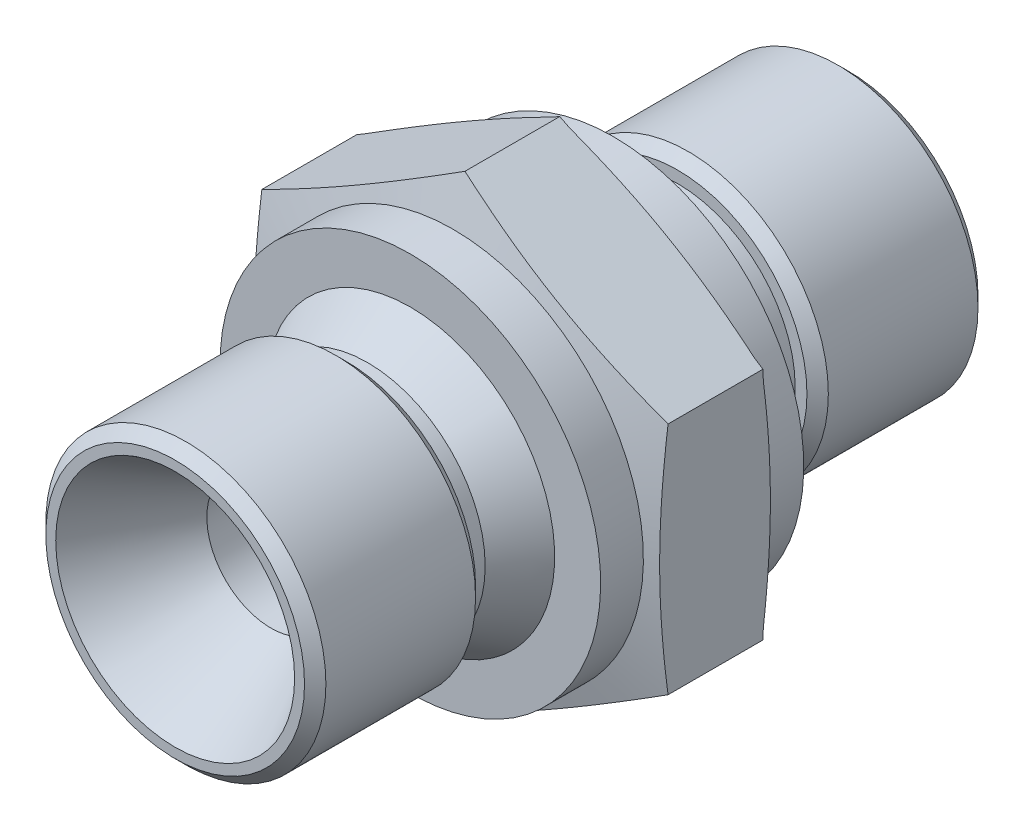
ISO-10303-21;
HEADER;
FILE_DESCRIPTION(('STEP AP214'),'2;1');
FILE_NAME('part.step','',(''),(''),'','','');
FILE_SCHEMA(('AUTOMOTIVE_DESIGN { 1 0 10303 214 1 1 1 1 }'));
ENDSEC;
DATA;
#1=APPLICATION_CONTEXT('core data for automotive mechanical design processes');
#2=APPLICATION_PROTOCOL_DEFINITION('international standard','automotive_design',2000,#1);
#3=PRODUCT_CONTEXT('',#1,'mechanical');
#4=PRODUCT('Part','Part','',(#3));
#5=PRODUCT_RELATED_PRODUCT_CATEGORY('part','',(#4));
#6=PRODUCT_DEFINITION_FORMATION('','',#4);
#7=PRODUCT_DEFINITION_CONTEXT('part definition',#1,'design');
#8=PRODUCT_DEFINITION('design','',#6,#7);
#9=PRODUCT_DEFINITION_SHAPE('','',#8);
#10=(LENGTH_UNIT() NAMED_UNIT(*) SI_UNIT(.MILLI.,.METRE.));
#11=(NAMED_UNIT(*) PLANE_ANGLE_UNIT() SI_UNIT($,.RADIAN.));
#12=(NAMED_UNIT(*) SI_UNIT($,.STERADIAN.) SOLID_ANGLE_UNIT());
#13=UNCERTAINTY_MEASURE_WITH_UNIT(LENGTH_MEASURE(1.E-05),#10,'distance_accuracy_value','');
#14=(GEOMETRIC_REPRESENTATION_CONTEXT(3) GLOBAL_UNCERTAINTY_ASSIGNED_CONTEXT((#13)) GLOBAL_UNIT_ASSIGNED_CONTEXT((#10,
#11,#12)) REPRESENTATION_CONTEXT('',''));
#15=CARTESIAN_POINT('',(0.,0.,0.));
#16=DIRECTION('',(0.,0.,1.));
#17=DIRECTION('',(1.,0.,0.));
#18=AXIS2_PLACEMENT_3D('',#15,#16,#17);
#19=CARTESIAN_POINT('',(0.,0.,0.25));
#20=DIRECTION('',(0.,0.,1.));
#21=DIRECTION('',(-1.,0.,0.));
#22=AXIS2_PLACEMENT_3D('',#19,#20,#21);
#23=CONICAL_SURFACE('',#22,6.3,0.7853981625);
#24=CARTESIAN_POINT('',(0.,0.,0.5));
#25=DIRECTION('',(0.,0.,-1.));
#26=DIRECTION('',(-1.,0.,0.));
#27=AXIS2_PLACEMENT_3D('',#24,#25,#26);
#28=CIRCLE('',#27,6.55);
#29=CARTESIAN_POINT('',(6.55,0.,0.5));
#30=VERTEX_POINT('',#29);
#31=EDGE_CURVE('E11',#30,#30,#28,.T.);
#32=ORIENTED_EDGE('',*,*,#31,.T.);
#33=EDGE_LOOP('',(#32));
#34=FACE_BOUND('',#33,.T.);
#35=CARTESIAN_POINT('',(0.,0.,0.));
#36=DIRECTION('',(0.,0.,1.));
#37=DIRECTION('',(-1.,0.,0.));
#38=AXIS2_PLACEMENT_3D('',#35,#36,#37);
#39=CIRCLE('',#38,6.05);
#40=CARTESIAN_POINT('',(6.05,0.,0.));
#41=VERTEX_POINT('',#40);
#42=EDGE_CURVE('E29',#41,#41,#39,.T.);
#43=ORIENTED_EDGE('',*,*,#42,.T.);
#44=EDGE_LOOP('',(#43));
#45=FACE_BOUND('',#44,.T.);
#46=ADVANCED_FACE('F16',(#34,#45),#23,.T.);
#47=CARTESIAN_POINT('',(0.,0.,0.));
#48=DIRECTION('',(0.,0.,1.));
#49=DIRECTION('',(-1.,0.,0.));
#50=AXIS2_PLACEMENT_3D('',#47,#48,#49);
#51=CYLINDRICAL_SURFACE('',#50,6.55);
#52=CARTESIAN_POINT('',(0.,0.,7.5));
#53=DIRECTION('',(0.,0.,1.));
#54=DIRECTION('',(-1.,0.,0.));
#55=AXIS2_PLACEMENT_3D('',#52,#53,#54);
#56=CIRCLE('',#55,6.55);
#57=CARTESIAN_POINT('',(6.55,0.,7.5));
#58=VERTEX_POINT('',#57);
#59=EDGE_CURVE('E321',#58,#58,#56,.T.);
#60=ORIENTED_EDGE('',*,*,#59,.F.);
#61=EDGE_LOOP('',(#60));
#62=FACE_BOUND('',#61,.T.);
#63=ORIENTED_EDGE('',*,*,#31,.F.);
#64=EDGE_LOOP('',(#63));
#65=FACE_BOUND('',#64,.T.);
#66=ADVANCED_FACE('F816',(#62,#65),#51,.T.);
#67=CARTESIAN_POINT('',(0.,0.,0.));
#68=DIRECTION('',(0.,0.,-1.));
#69=DIRECTION('',(0.,-1.,0.));
#70=AXIS2_PLACEMENT_3D('',#67,#68,#69);
#71=PLANE('',#70);
#72=ORIENTED_EDGE('',*,*,#42,.F.);
#73=EDGE_LOOP('',(#72));
#74=FACE_BOUND('',#73,.T.);
#75=CARTESIAN_POINT('',(0.,0.,0.));
#76=DIRECTION('',(0.,0.,1.));
#77=DIRECTION('',(0.,1.,0.));
#78=AXIS2_PLACEMENT_3D('',#75,#76,#77);
#79=CIRCLE('',#78,5.5870038977793);
#80=CARTESIAN_POINT('',(0.,5.5870038977793,0.));
#81=VERTEX_POINT('',#80);
#82=EDGE_CURVE('E338',#81,#81,#79,.T.);
#83=ORIENTED_EDGE('',*,*,#82,.T.);
#84=EDGE_LOOP('',(#83));
#85=FACE_BOUND('',#84,.T.);
#86=ADVANCED_FACE('F754',(#74,#85),#71,.T.);
#87=CARTESIAN_POINT('',(0.,0.,7.75));
#88=DIRECTION('',(0.,0.,-1.));
#89=DIRECTION('',(-1.,0.,0.));
#90=AXIS2_PLACEMENT_3D('',#87,#88,#89);
#91=CONICAL_SURFACE('',#90,6.3,0.7853981625);
#92=CARTESIAN_POINT('',(0.,0.,8.));
#93=DIRECTION('',(0.,0.,-1.));
#94=DIRECTION('',(-1.,0.,0.));
#95=AXIS2_PLACEMENT_3D('',#92,#93,#94);
#96=CIRCLE('',#95,6.05);
#97=CARTESIAN_POINT('',(6.05,0.,8.));
#98=VERTEX_POINT('',#97);
#99=EDGE_CURVE('E331',#98,#98,#96,.T.);
#100=ORIENTED_EDGE('',*,*,#99,.T.);
#101=EDGE_LOOP('',(#100));
#102=FACE_BOUND('',#101,.T.);
#103=ORIENTED_EDGE('',*,*,#59,.T.);
#104=EDGE_LOOP('',(#103));
#105=FACE_BOUND('',#104,.T.);
#106=ADVANCED_FACE('F749',(#102,#105),#91,.T.);
#107=CARTESIAN_POINT('',(0.,8.60474599129892,8.));
#108=DIRECTION('',(0.,0.,-1.));
#109=DIRECTION('',(0.,-1.,0.));
#110=AXIS2_PLACEMENT_3D('',#107,#108,#109);
#111=PLANE('',#110);
#112=ORIENTED_EDGE('',*,*,#99,.F.);
#113=EDGE_LOOP('',(#112));
#114=FACE_BOUND('',#113,.T.);
#115=CARTESIAN_POINT('',(0.,0.,8.));
#116=DIRECTION('',(0.,0.,1.));
#117=DIRECTION('',(0.,1.,0.));
#118=AXIS2_PLACEMENT_3D('',#115,#116,#117);
#119=CIRCLE('',#118,5.5);
#120=CARTESIAN_POINT('',(0.,5.5,8.));
#121=VERTEX_POINT('',#120);
#122=EDGE_CURVE('E366',#121,#121,#119,.T.);
#123=ORIENTED_EDGE('',*,*,#122,.F.);
#124=EDGE_LOOP('',(#123));
#125=FACE_BOUND('',#124,.T.);
#126=ADVANCED_FACE('F753',(#114,#125),#111,.F.);
#127=CARTESIAN_POINT('',(0.,0.,31.25));
#128=DIRECTION('',(0.,0.,-1.));
#129=DIRECTION('',(-1.,0.,0.));
#130=AXIS2_PLACEMENT_3D('',#127,#128,#129);
#131=CONICAL_SURFACE('',#130,6.3,0.785398162500002);
#132=CARTESIAN_POINT('',(0.,0.,31.5));
#133=DIRECTION('',(0.,0.,-1.));
#134=DIRECTION('',(-1.,0.,0.));
#135=AXIS2_PLACEMENT_3D('',#132,#133,#134);
#136=CIRCLE('',#135,6.05);
#137=CARTESIAN_POINT('',(6.05,0.,31.5));
#138=VERTEX_POINT('',#137);
#139=EDGE_CURVE('E314',#138,#138,#136,.T.);
#140=ORIENTED_EDGE('',*,*,#139,.T.);
#141=EDGE_LOOP('',(#140));
#142=FACE_BOUND('',#141,.T.);
#143=CARTESIAN_POINT('',(0.,0.,31.));
#144=DIRECTION('',(0.,0.,1.));
#145=DIRECTION('',(-1.,0.,0.));
#146=AXIS2_PLACEMENT_3D('',#143,#144,#145);
#147=CIRCLE('',#146,6.55);
#148=CARTESIAN_POINT('',(6.55,0.,31.));
#149=VERTEX_POINT('',#148);
#150=EDGE_CURVE('E322',#149,#149,#147,.T.);
#151=ORIENTED_EDGE('',*,*,#150,.T.);
#152=EDGE_LOOP('',(#151));
#153=FACE_BOUND('',#152,.T.);
#154=ADVANCED_FACE('F860',(#142,#153),#131,.T.);
#155=CARTESIAN_POINT('',(0.,0.,20.5));
#156=DIRECTION('',(0.,0.,1.));
#157=DIRECTION('',(-1.,0.,0.));
#158=AXIS2_PLACEMENT_3D('',#155,#156,#157);
#159=CYLINDRICAL_SURFACE('',#158,6.55);
#160=CARTESIAN_POINT('',(0.,0.,24.));
#161=DIRECTION('',(0.,0.,-1.));
#162=DIRECTION('',(-1.,0.,0.));
#163=AXIS2_PLACEMENT_3D('',#160,#161,#162);
#164=CIRCLE('',#163,6.55);
#165=CARTESIAN_POINT('',(6.55,0.,24.));
#166=VERTEX_POINT('',#165);
#167=EDGE_CURVE('E343',#166,#166,#164,.T.);
#168=ORIENTED_EDGE('',*,*,#167,.F.);
#169=EDGE_LOOP('',(#168));
#170=FACE_BOUND('',#169,.T.);
#171=ORIENTED_EDGE('',*,*,#150,.F.);
#172=EDGE_LOOP('',(#171));
#173=FACE_BOUND('',#172,.T.);
#174=ADVANCED_FACE('F763',(#170,#173),#159,.T.);
#175=CARTESIAN_POINT('',(0.,0.,31.5));
#176=DIRECTION('',(0.,0.,-1.));
#177=DIRECTION('',(0.,-1.,0.));
#178=AXIS2_PLACEMENT_3D('',#175,#176,#177);
#179=PLANE('',#178);
#180=ORIENTED_EDGE('',*,*,#139,.F.);
#181=EDGE_LOOP('',(#180));
#182=FACE_BOUND('',#181,.T.);
#183=CARTESIAN_POINT('',(0.,0.,31.5));
#184=DIRECTION('',(0.,0.,-1.));
#185=DIRECTION('',(0.,1.,0.));
#186=AXIS2_PLACEMENT_3D('',#183,#184,#185);
#187=CIRCLE('',#186,5.5870038977793);
#188=CARTESIAN_POINT('',(0.,5.5870038977793,31.5));
#189=VERTEX_POINT('',#188);
#190=EDGE_CURVE('E326',#189,#189,#187,.T.);
#191=ORIENTED_EDGE('',*,*,#190,.T.);
#192=EDGE_LOOP('',(#191));
#193=FACE_BOUND('',#192,.T.);
#194=ADVANCED_FACE('F759',(#182,#193),#179,.F.);
#195=CARTESIAN_POINT('',(0.,0.,23.75));
#196=DIRECTION('',(0.,0.,1.));
#197=DIRECTION('',(-1.,0.,0.));
#198=AXIS2_PLACEMENT_3D('',#195,#196,#197);
#199=CONICAL_SURFACE('',#198,6.3,0.785398162500002);
#200=CARTESIAN_POINT('',(0.,0.,23.5));
#201=DIRECTION('',(0.,0.,1.));
#202=DIRECTION('',(-1.,0.,0.));
#203=AXIS2_PLACEMENT_3D('',#200,#201,#202);
#204=CIRCLE('',#203,6.05);
#205=CARTESIAN_POINT('',(6.05,0.,23.5));
#206=VERTEX_POINT('',#205);
#207=EDGE_CURVE('E339',#206,#206,#204,.T.);
#208=ORIENTED_EDGE('',*,*,#207,.T.);
#209=EDGE_LOOP('',(#208));
#210=FACE_BOUND('',#209,.T.);
#211=ORIENTED_EDGE('',*,*,#167,.T.);
#212=EDGE_LOOP('',(#211));
#213=FACE_BOUND('',#212,.T.);
#214=ADVANCED_FACE('F744',(#210,#213),#199,.T.);
#215=CARTESIAN_POINT('',(0.,8.67613642504743,23.5));
#216=DIRECTION('',(0.,0.,1.));
#217=DIRECTION('',(1.,0.,0.));
#218=AXIS2_PLACEMENT_3D('',#215,#216,#217);
#219=PLANE('',#218);
#220=ORIENTED_EDGE('',*,*,#207,.F.);
#221=EDGE_LOOP('',(#220));
#222=FACE_BOUND('',#221,.T.);
#223=CARTESIAN_POINT('',(0.,0.,23.5));
#224=DIRECTION('',(0.,0.,1.));
#225=DIRECTION('',(0.,1.,0.));
#226=AXIS2_PLACEMENT_3D('',#223,#224,#225);
#227=CIRCLE('',#226,5.5);
#228=CARTESIAN_POINT('',(0.,5.5,23.5));
#229=VERTEX_POINT('',#228);
#230=EDGE_CURVE('E512',#229,#229,#227,.T.);
#231=ORIENTED_EDGE('',*,*,#230,.T.);
#232=EDGE_LOOP('',(#231));
#233=FACE_BOUND('',#232,.T.);
#234=ADVANCED_FACE('F18',(#222,#233),#219,.F.);
#235=CARTESIAN_POINT('',(0.,0.,13.244734572664));
#236=DIRECTION('',(0.,0.,1.));
#237=DIRECTION('',(0.,1.,0.));
#238=AXIS2_PLACEMENT_3D('',#235,#236,#237);
#239=CONICAL_SURFACE('',#238,9.81336185955067,1.3089969375);
#240=CARTESIAN_POINT('',(0.,0.,13.));
#241=DIRECTION('',(0.,0.,1.));
#242=DIRECTION('',(0.,1.,0.));
#243=AXIS2_PLACEMENT_3D('',#240,#241,#242);
#244=CIRCLE('',#243,8.9);
#245=CARTESIAN_POINT('',(0.,8.9,13.));
#246=VERTEX_POINT('',#245);
#247=EDGE_CURVE('E295',#246,#246,#244,.T.);
#248=ORIENTED_EDGE('',*,*,#247,.T.);
#249=EDGE_LOOP('',(#248));
#250=FACE_BOUND('',#249,.T.);
#251=CARTESIAN_POINT('',(-9.5,4.98122492424616,13.489469145328));
#252=CARTESIAN_POINT('',(-9.50000000000001,0.,12.869660453127));
#253=CARTESIAN_POINT('',(-9.5,-4.98122492424616,13.489469145328));
#254=(BOUNDED_CURVE() B_SPLINE_CURVE(2,(#251,#252,#253),.UNSPECIFIED.,.F.,
.F.) B_SPLINE_CURVE_WITH_KNOTS((3,3),(0.,0.998411642412234),
.UNSPECIFIED.) CURVE() GEOMETRIC_REPRESENTATION_ITEM() RATIONAL_B_SPLINE_CURVE((1.,
1.12912881253698,1.)) REPRESENTATION_ITEM(''));
#255=CARTESIAN_POINT('',(-9.5,4.98122492424616,13.489469145328));
#256=VERTEX_POINT('',#255);
#257=CARTESIAN_POINT('',(-9.5,-4.98122492424616,13.489469145328));
#258=VERTEX_POINT('',#257);
#259=EDGE_CURVE('E411',#256,#258,#254,.T.);
#260=ORIENTED_EDGE('',*,*,#259,.F.);
#261=CARTESIAN_POINT('',(0.,0.,13.489469145328));
#262=DIRECTION('',(0.,0.,1.));
#263=DIRECTION('',(0.,1.,0.));
#264=AXIS2_PLACEMENT_3D('',#261,#262,#263);
#265=CIRCLE('',#264,10.7267237191013);
#266=CARTESIAN_POINT('',(-9.06386732636139,5.73662887382909,13.489469145328));
#267=VERTEX_POINT('',#266);
#268=EDGE_CURVE('E359',#267,#256,#265,.T.);
#269=ORIENTED_EDGE('',*,*,#268,.F.);
#270=CARTESIAN_POINT('',(-0.436132673638619,10.7178537980752,13.489469145328));
#271=CARTESIAN_POINT('',(-4.75,8.22724133595217,12.869660453127));
#272=CARTESIAN_POINT('',(-9.06386732636138,5.73662887382909,13.489469145328));
#273=(BOUNDED_CURVE() B_SPLINE_CURVE(2,(#270,#271,#272),.UNSPECIFIED.,.F.,
.F.) B_SPLINE_CURVE_WITH_KNOTS((3,3),(0.,0.998411642412233),
.UNSPECIFIED.) CURVE() GEOMETRIC_REPRESENTATION_ITEM() RATIONAL_B_SPLINE_CURVE((1.,
1.12912881253697,1.)) REPRESENTATION_ITEM(''));
#274=CARTESIAN_POINT('',(-0.436132673638618,10.7178537980752,13.489469145328));
#275=VERTEX_POINT('',#274);
#276=EDGE_CURVE('E372',#275,#267,#273,.T.);
#277=ORIENTED_EDGE('',*,*,#276,.F.);
#278=CARTESIAN_POINT('',(0.,0.,13.489469145328));
#279=DIRECTION('',(0.,0.,1.));
#280=DIRECTION('',(0.,1.,0.));
#281=AXIS2_PLACEMENT_3D('',#278,#279,#280);
#282=CIRCLE('',#281,10.7267237191013);
#283=CARTESIAN_POINT('',(0.436132673638621,10.7178537980752,13.489469145328));
#284=VERTEX_POINT('',#283);
#285=EDGE_CURVE('E270',#284,#275,#282,.T.);
#286=ORIENTED_EDGE('',*,*,#285,.F.);
#287=CARTESIAN_POINT('',(9.06386732636138,5.7366288738291,13.489469145328));
#288=CARTESIAN_POINT('',(4.75,8.22724133595217,12.869660453127));
#289=CARTESIAN_POINT('',(0.436132673638619,10.7178537980752,13.489469145328));
#290=(BOUNDED_CURVE() B_SPLINE_CURVE(2,(#287,#288,#289),.UNSPECIFIED.,.F.,
.F.) B_SPLINE_CURVE_WITH_KNOTS((3,3),(0.,0.998411642412232),
.UNSPECIFIED.) CURVE() GEOMETRIC_REPRESENTATION_ITEM() RATIONAL_B_SPLINE_CURVE((1.,
1.12912881253698,1.)) REPRESENTATION_ITEM(''));
#291=CARTESIAN_POINT('',(9.06386732636138,5.7366288738291,13.489469145328));
#292=VERTEX_POINT('',#291);
#293=EDGE_CURVE('E278',#292,#284,#290,.T.);
#294=ORIENTED_EDGE('',*,*,#293,.F.);
#295=CARTESIAN_POINT('',(0.,0.,13.489469145328));
#296=DIRECTION('',(0.,0.,1.));
#297=DIRECTION('',(0.,1.,0.));
#298=AXIS2_PLACEMENT_3D('',#295,#296,#297);
#299=CIRCLE('',#298,10.7267237191013);
#300=CARTESIAN_POINT('',(9.5,4.98122492424615,13.489469145328));
#301=VERTEX_POINT('',#300);
#302=EDGE_CURVE('E269',#301,#292,#299,.T.);
#303=ORIENTED_EDGE('',*,*,#302,.F.);
#304=CARTESIAN_POINT('',(9.5,-4.98122492424615,13.489469145328));
#305=CARTESIAN_POINT('',(9.49999999999999,0.,12.869660453127));
#306=CARTESIAN_POINT('',(9.5,4.98122492424615,13.489469145328));
#307=(BOUNDED_CURVE() B_SPLINE_CURVE(2,(#304,#305,#306),.UNSPECIFIED.,.F.,
.F.) B_SPLINE_CURVE_WITH_KNOTS((3,3),(0.,0.998411642412232),
.UNSPECIFIED.) CURVE() GEOMETRIC_REPRESENTATION_ITEM() RATIONAL_B_SPLINE_CURVE((1.,
1.12912881253698,1.)) REPRESENTATION_ITEM(''));
#308=CARTESIAN_POINT('',(9.5,-4.98122492424615,13.489469145328));
#309=VERTEX_POINT('',#308);
#310=EDGE_CURVE('E305',#309,#301,#307,.T.);
#311=ORIENTED_EDGE('',*,*,#310,.F.);
#312=CARTESIAN_POINT('',(0.,0.,13.489469145328));
#313=DIRECTION('',(0.,0.,1.));
#314=DIRECTION('',(0.,1.,0.));
#315=AXIS2_PLACEMENT_3D('',#312,#313,#314);
#316=CIRCLE('',#315,10.7267237191013);
#317=CARTESIAN_POINT('',(9.06386732636138,-5.7366288738291,13.489469145328));
#318=VERTEX_POINT('',#317);
#319=EDGE_CURVE('E288',#318,#309,#316,.T.);
#320=ORIENTED_EDGE('',*,*,#319,.F.);
#321=CARTESIAN_POINT('',(0.436132673638616,-10.7178537980752,13.489469145328));
#322=CARTESIAN_POINT('',(4.75000000000001,-8.22724133595216,12.869660453127));
#323=CARTESIAN_POINT('',(9.06386732636138,-5.7366288738291,13.489469145328));
#324=(BOUNDED_CURVE() B_SPLINE_CURVE(2,(#321,#322,#323),.UNSPECIFIED.,.F.,
.F.) B_SPLINE_CURVE_WITH_KNOTS((3,3),(0.,0.998411642412232),
.UNSPECIFIED.) CURVE() GEOMETRIC_REPRESENTATION_ITEM() RATIONAL_B_SPLINE_CURVE((1.,
1.12912881253698,1.)) REPRESENTATION_ITEM(''));
#325=CARTESIAN_POINT('',(0.436132673638616,-10.7178537980752,13.489469145328));
#326=VERTEX_POINT('',#325);
#327=EDGE_CURVE('E297',#326,#318,#324,.T.);
#328=ORIENTED_EDGE('',*,*,#327,.F.);
#329=CARTESIAN_POINT('',(0.,0.,13.489469145328));
#330=DIRECTION('',(0.,0.,1.));
#331=DIRECTION('',(0.,1.,0.));
#332=AXIS2_PLACEMENT_3D('',#329,#330,#331);
#333=CIRCLE('',#332,10.7267237191013);
#334=CARTESIAN_POINT('',(-0.436132673638613,-10.7178537980752,13.489469145328));
#335=VERTEX_POINT('',#334);
#336=EDGE_CURVE('E296',#335,#326,#333,.T.);
#337=ORIENTED_EDGE('',*,*,#336,.F.);
#338=CARTESIAN_POINT('',(-9.06386732636139,-5.73662887382908,13.489469145328));
#339=CARTESIAN_POINT('',(-4.75,-8.22724133595216,12.869660453127));
#340=CARTESIAN_POINT('',(-0.436132673638615,-10.7178537980752,13.489469145328));
#341=(BOUNDED_CURVE() B_SPLINE_CURVE(2,(#338,#339,#340),.UNSPECIFIED.,.F.,
.F.) B_SPLINE_CURVE_WITH_KNOTS((3,3),(0.,0.998411642412233),
.UNSPECIFIED.) CURVE() GEOMETRIC_REPRESENTATION_ITEM() RATIONAL_B_SPLINE_CURVE((1.,
1.12912881253697,1.)) REPRESENTATION_ITEM(''));
#342=CARTESIAN_POINT('',(-9.06386732636139,-5.73662887382908,13.489469145328));
#343=VERTEX_POINT('',#342);
#344=EDGE_CURVE('E260',#343,#335,#341,.T.);
#345=ORIENTED_EDGE('',*,*,#344,.F.);
#346=CARTESIAN_POINT('',(0.,0.,13.489469145328));
#347=DIRECTION('',(0.,0.,1.));
#348=DIRECTION('',(0.,1.,0.));
#349=AXIS2_PLACEMENT_3D('',#346,#347,#348);
#350=CIRCLE('',#349,10.7267237191013);
#351=EDGE_CURVE('E265',#258,#343,#350,.T.);
#352=ORIENTED_EDGE('',*,*,#351,.F.);
#353=EDGE_LOOP('',(#260,#269,#277,#286,#294,#303,#311,#320,#328,#337,#345,#352));
#354=FACE_BOUND('',#353,.T.);
#355=ADVANCED_FACE('F551',(#250,#354),#239,.T.);
#356=CARTESIAN_POINT('',(0.,0.,13.5337284311498));
#357=DIRECTION('',(0.,0.,1.));
#358=DIRECTION('',(0.,1.,0.));
#359=AXIS2_PLACEMENT_3D('',#356,#357,#358);
#360=CONICAL_SURFACE('',#359,11.2181078508496,1.48096807371411);
#361=CARTESIAN_POINT('',(9.06386732636139,-5.7366288738291,13.489469145328));
#362=CARTESIAN_POINT('',(9.27949200414431,-5.6121379080672,13.4998832074341));
#363=CARTESIAN_POINT('',(9.5,-5.48482755730145,13.511350132877));
#364=(BOUNDED_CURVE() B_SPLINE_CURVE(2,(#361,#362,#363),.UNSPECIFIED.,.F.,
.F.) B_SPLINE_CURVE_WITH_KNOTS((3,3),(1.68972396854524,1.74182421769364),
.UNSPECIFIED.) CURVE() GEOMETRIC_REPRESENTATION_ITEM() RATIONAL_B_SPLINE_CURVE((1.18711710478456,
1.18036981377816,1.17302854231151)) REPRESENTATION_ITEM(''));
#365=CARTESIAN_POINT('',(9.5,-5.48482755730145,13.511350132877));
#366=VERTEX_POINT('',#365);
#367=EDGE_CURVE('E304',#318,#366,#364,.T.);
#368=ORIENTED_EDGE('',*,*,#367,.F.);
#369=ORIENTED_EDGE('',*,*,#319,.T.);
#370=CARTESIAN_POINT('',(9.5,-5.48482755730143,13.511350132877));
#371=CARTESIAN_POINT('',(9.5,-5.23020685576572,13.4998832074339));
#372=CARTESIAN_POINT('',(9.50000000000001,-4.98122492424616,13.489469145328));
#373=(BOUNDED_CURVE() B_SPLINE_CURVE(2,(#370,#371,#372),.UNSPECIFIED.,.F.,
.F.) B_SPLINE_CURVE_WITH_KNOTS((3,3),(0.,0.044390526597902),
.UNSPECIFIED.) CURVE() GEOMETRIC_REPRESENTATION_ITEM() RATIONAL_B_SPLINE_CURVE((1.,
1.00625839116611,1.01201041744947)) REPRESENTATION_ITEM(''));
#374=EDGE_CURVE('E313',#366,#309,#373,.T.);
#375=ORIENTED_EDGE('',*,*,#374,.F.);
#376=EDGE_LOOP('',(#368,#369,#375));
#377=FACE_BOUND('',#376,.T.);
#378=ADVANCED_FACE('F558',(#377),#360,.T.);
#379=CARTESIAN_POINT('',(0.,0.,13.5337284311498));
#380=DIRECTION('',(0.,0.,1.));
#381=DIRECTION('',(0.,1.,0.));
#382=AXIS2_PLACEMENT_3D('',#379,#380,#381);
#383=CONICAL_SURFACE('',#382,11.2181078508496,1.48096807371411);
#384=CARTESIAN_POINT('',(-0.436132673638613,-10.7178537980753,13.489469145328));
#385=CARTESIAN_POINT('',(-0.220507995855687,-10.8423447638371,13.4998832074341));
#386=CARTESIAN_POINT('',(0.,-10.9696551146029,13.511350132877));
#387=(BOUNDED_CURVE() B_SPLINE_CURVE(2,(#384,#385,#386),.UNSPECIFIED.,.F.,
.F.) B_SPLINE_CURVE_WITH_KNOTS((3,3),(1.68972396854524,1.74182421769364),
.UNSPECIFIED.) CURVE() GEOMETRIC_REPRESENTATION_ITEM() RATIONAL_B_SPLINE_CURVE((1.18711710478456,
1.18036981377816,1.17302854231151)) REPRESENTATION_ITEM(''));
#388=CARTESIAN_POINT('',(0.,-10.9696551146029,13.511350132877));
#389=VERTEX_POINT('',#388);
#390=EDGE_CURVE('E252',#335,#389,#387,.T.);
#391=ORIENTED_EDGE('',*,*,#390,.F.);
#392=ORIENTED_EDGE('',*,*,#336,.T.);
#393=CARTESIAN_POINT('',(0.,-10.9696551146029,13.511350132877));
#394=CARTESIAN_POINT('',(0.220507995862869,-10.842344763833,13.4998832074337));
#395=CARTESIAN_POINT('',(0.436132673638617,-10.7178537980753,13.489469145328));
#396=(BOUNDED_CURVE() B_SPLINE_CURVE(2,(#393,#394,#395),.UNSPECIFIED.,.F.,
.F.) B_SPLINE_CURVE_WITH_KNOTS((3,3),(0.453963427413946,0.506063676562346),
.UNSPECIFIED.) CURVE() GEOMETRIC_REPRESENTATION_ITEM() RATIONAL_B_SPLINE_CURVE((1.17302854231151,
1.18036981377816,1.18711710478456)) REPRESENTATION_ITEM(''));
#397=EDGE_CURVE('E303',#389,#326,#396,.T.);
#398=ORIENTED_EDGE('',*,*,#397,.F.);
#399=EDGE_LOOP('',(#391,#392,#398));
#400=FACE_BOUND('',#399,.T.);
#401=ADVANCED_FACE('F554',(#400),#383,.T.);
#402=CARTESIAN_POINT('',(0.,0.,13.5337284311498));
#403=DIRECTION('',(0.,0.,1.));
#404=DIRECTION('',(0.,1.,0.));
#405=AXIS2_PLACEMENT_3D('',#402,#403,#404);
#406=CONICAL_SURFACE('',#405,11.2181078508496,1.48096807371411);
#407=CARTESIAN_POINT('',(9.5,5.48482755730145,13.511350132877));
#408=CARTESIAN_POINT('',(9.27949200413713,5.61213790807135,13.4998832074337));
#409=CARTESIAN_POINT('',(9.06386732636137,5.7366288738291,13.489469145328));
#410=(BOUNDED_CURVE() B_SPLINE_CURVE(2,(#407,#408,#409),.UNSPECIFIED.,.F.,
.F.) B_SPLINE_CURVE_WITH_KNOTS((3,3),(0.453963427413946,0.506063676562347),
.UNSPECIFIED.) CURVE() GEOMETRIC_REPRESENTATION_ITEM() RATIONAL_B_SPLINE_CURVE((1.17302854231151,
1.18036981377816,1.18711710478456)) REPRESENTATION_ITEM(''));
#411=CARTESIAN_POINT('',(9.5,5.48482755730145,13.511350132877));
#412=VERTEX_POINT('',#411);
#413=EDGE_CURVE('E271',#412,#292,#410,.T.);
#414=ORIENTED_EDGE('',*,*,#413,.F.);
#415=CARTESIAN_POINT('',(9.50000000000001,4.98122492424616,13.489469145328));
#416=CARTESIAN_POINT('',(9.5,5.23020685576572,13.4998832074339));
#417=CARTESIAN_POINT('',(9.5,5.48482755730143,13.511350132877));
#418=(BOUNDED_CURVE() B_SPLINE_CURVE(2,(#415,#416,#417),.UNSPECIFIED.,.F.,
.F.) B_SPLINE_CURVE_WITH_KNOTS((3,3),(1.0528944115546,1.0972849381525),
.UNSPECIFIED.) CURVE() GEOMETRIC_REPRESENTATION_ITEM() RATIONAL_B_SPLINE_CURVE((1.01201041744947,
1.00625839116611,1.)) REPRESENTATION_ITEM(''));
#419=EDGE_CURVE('E401',#301,#412,#418,.T.);
#420=ORIENTED_EDGE('',*,*,#419,.F.);
#421=ORIENTED_EDGE('',*,*,#302,.T.);
#422=EDGE_LOOP('',(#414,#420,#421));
#423=FACE_BOUND('',#422,.T.);
#424=ADVANCED_FACE('F789',(#423),#406,.T.);
#425=CARTESIAN_POINT('',(0.,0.,13.5337284311498));
#426=DIRECTION('',(0.,0.,1.));
#427=DIRECTION('',(0.,1.,0.));
#428=AXIS2_PLACEMENT_3D('',#425,#426,#427);
#429=CONICAL_SURFACE('',#428,11.2181078508496,1.48096807371411);
#430=CARTESIAN_POINT('',(-9.5,-4.98122492424616,13.489469145328));
#431=CARTESIAN_POINT('',(-9.49999999999999,-5.23020685576572,13.4998832074339));
#432=CARTESIAN_POINT('',(-9.5,-5.48482755730142,13.511350132877));
#433=(BOUNDED_CURVE() B_SPLINE_CURVE(2,(#430,#431,#432),.UNSPECIFIED.,.F.,
.F.) B_SPLINE_CURVE_WITH_KNOTS((3,3),(1.0528944115546,1.0972849381525),
.UNSPECIFIED.) CURVE() GEOMETRIC_REPRESENTATION_ITEM() RATIONAL_B_SPLINE_CURVE((1.01201041744948,
1.00625839116611,1.)) REPRESENTATION_ITEM(''));
#434=CARTESIAN_POINT('',(-9.5,-5.48482755730144,13.511350132877));
#435=VERTEX_POINT('',#434);
#436=EDGE_CURVE('E416',#258,#435,#433,.T.);
#437=ORIENTED_EDGE('',*,*,#436,.F.);
#438=ORIENTED_EDGE('',*,*,#351,.T.);
#439=CARTESIAN_POINT('',(-9.5,-5.48482755730144,13.511350132877));
#440=CARTESIAN_POINT('',(-9.27949200413713,-5.61213790807133,13.4998832074337));
#441=CARTESIAN_POINT('',(-9.06386732636139,-5.73662887382909,13.489469145328));
#442=(BOUNDED_CURVE() B_SPLINE_CURVE(2,(#439,#440,#441),.UNSPECIFIED.,.F.,
.F.) B_SPLINE_CURVE_WITH_KNOTS((3,3),(0.453963427413946,0.506063676562346),
.UNSPECIFIED.) CURVE() GEOMETRIC_REPRESENTATION_ITEM() RATIONAL_B_SPLINE_CURVE((1.17302854231151,
1.18036981377816,1.18711710478456)) REPRESENTATION_ITEM(''));
#443=EDGE_CURVE('E247',#435,#343,#442,.T.);
#444=ORIENTED_EDGE('',*,*,#443,.F.);
#445=EDGE_LOOP('',(#437,#438,#444));
#446=FACE_BOUND('',#445,.T.);
#447=ADVANCED_FACE('F793',(#446),#429,.T.);
#448=CARTESIAN_POINT('',(0.,0.,13.5337284311498));
#449=DIRECTION('',(0.,0.,1.));
#450=DIRECTION('',(0.,1.,0.));
#451=AXIS2_PLACEMENT_3D('',#448,#449,#450);
#452=CONICAL_SURFACE('',#451,11.2181078508496,1.48096807371411);
#453=CARTESIAN_POINT('',(0.,10.9696551146029,13.511350132877));
#454=CARTESIAN_POINT('',(-0.22050799586287,10.842344763833,13.4998832074337));
#455=CARTESIAN_POINT('',(-0.436132673638619,10.7178537980753,13.489469145328));
#456=(BOUNDED_CURVE() B_SPLINE_CURVE(2,(#453,#454,#455),.UNSPECIFIED.,.F.,
.F.) B_SPLINE_CURVE_WITH_KNOTS((3,3),(0.453963427413945,0.506063676562346),
.UNSPECIFIED.) CURVE() GEOMETRIC_REPRESENTATION_ITEM() RATIONAL_B_SPLINE_CURVE((1.17302854231151,
1.18036981377816,1.18711710478456)) REPRESENTATION_ITEM(''));
#457=CARTESIAN_POINT('',(0.,10.9696551146029,13.511350132877));
#458=VERTEX_POINT('',#457);
#459=EDGE_CURVE('E434',#458,#275,#456,.T.);
#460=ORIENTED_EDGE('',*,*,#459,.F.);
#461=CARTESIAN_POINT('',(0.436132673638622,10.7178537980753,13.489469145328));
#462=CARTESIAN_POINT('',(0.220507995855689,10.8423447638371,13.4998832074341));
#463=CARTESIAN_POINT('',(0.,10.9696551146029,13.511350132877));
#464=(BOUNDED_CURVE() B_SPLINE_CURVE(2,(#461,#462,#463),.UNSPECIFIED.,.F.,
.F.) B_SPLINE_CURVE_WITH_KNOTS((3,3),(1.68972396854524,1.74182421769364),
.UNSPECIFIED.) CURVE() GEOMETRIC_REPRESENTATION_ITEM() RATIONAL_B_SPLINE_CURVE((1.18711710478456,
1.18036981377816,1.17302854231151)) REPRESENTATION_ITEM(''));
#465=EDGE_CURVE('E367',#284,#458,#464,.T.);
#466=ORIENTED_EDGE('',*,*,#465,.F.);
#467=ORIENTED_EDGE('',*,*,#285,.T.);
#468=EDGE_LOOP('',(#460,#466,#467));
#469=FACE_BOUND('',#468,.T.);
#470=ADVANCED_FACE('F894',(#469),#452,.T.);
#471=CARTESIAN_POINT('',(0.,0.,10.));
#472=DIRECTION('',(0.,0.,1.));
#473=DIRECTION('',(0.,1.,0.));
#474=AXIS2_PLACEMENT_3D('',#471,#472,#473);
#475=CONICAL_SURFACE('',#474,6.125,0.558599314705258);
#476=CARTESIAN_POINT('',(0.,0.,9.));
#477=DIRECTION('',(0.,0.,1.));
#478=DIRECTION('',(0.,1.,0.));
#479=AXIS2_PLACEMENT_3D('',#476,#477,#478);
#480=CIRCLE('',#479,5.5);
#481=CARTESIAN_POINT('',(0.,5.5,9.));
#482=VERTEX_POINT('',#481);
#483=EDGE_CURVE('E380',#482,#482,#480,.T.);
#484=ORIENTED_EDGE('',*,*,#483,.T.);
#485=EDGE_LOOP('',(#484));
#486=FACE_BOUND('',#485,.T.);
#487=CARTESIAN_POINT('',(0.,0.,11.));
#488=DIRECTION('',(0.,0.,1.));
#489=DIRECTION('',(0.,1.,0.));
#490=AXIS2_PLACEMENT_3D('',#487,#488,#489);
#491=CIRCLE('',#490,6.75);
#492=CARTESIAN_POINT('',(0.,6.75,11.));
#493=VERTEX_POINT('',#492);
#494=EDGE_CURVE('E279',#493,#493,#491,.T.);
#495=ORIENTED_EDGE('',*,*,#494,.F.);
#496=EDGE_LOOP('',(#495));
#497=FACE_BOUND('',#496,.T.);
#498=ADVANCED_FACE('F774',(#486,#497),#475,.T.);
#499=CARTESIAN_POINT('',(0.,0.,8.5));
#500=DIRECTION('',(0.,0.,1.));
#501=DIRECTION('',(0.,1.,0.));
#502=AXIS2_PLACEMENT_3D('',#499,#500,#501);
#503=CYLINDRICAL_SURFACE('',#502,5.5);
#504=ORIENTED_EDGE('',*,*,#122,.T.);
#505=EDGE_LOOP('',(#504));
#506=FACE_BOUND('',#505,.T.);
#507=ORIENTED_EDGE('',*,*,#483,.F.);
#508=EDGE_LOOP('',(#507));
#509=FACE_BOUND('',#508,.T.);
#510=ADVANCED_FACE('F769',(#506,#509),#503,.T.);
#511=CARTESIAN_POINT('',(0.,0.,13.5337284311498));
#512=DIRECTION('',(0.,0.,1.));
#513=DIRECTION('',(0.,1.,0.));
#514=AXIS2_PLACEMENT_3D('',#511,#512,#513);
#515=CONICAL_SURFACE('',#514,11.2181078508496,1.48096807371411);
#516=CARTESIAN_POINT('',(-9.5,5.48482755730142,13.511350132877));
#517=CARTESIAN_POINT('',(-9.49999999999999,5.23020685576572,13.4998832074339));
#518=CARTESIAN_POINT('',(-9.5,4.98122492424616,13.489469145328));
#519=(BOUNDED_CURVE() B_SPLINE_CURVE(2,(#516,#517,#518),.UNSPECIFIED.,.F.,
.F.) B_SPLINE_CURVE_WITH_KNOTS((3,3),(0.,0.044390526597899),
.UNSPECIFIED.) CURVE() GEOMETRIC_REPRESENTATION_ITEM() RATIONAL_B_SPLINE_CURVE((1.,
1.00625839116611,1.01201041744948)) REPRESENTATION_ITEM(''));
#520=CARTESIAN_POINT('',(-9.5,5.48482755730144,13.511350132877));
#521=VERTEX_POINT('',#520);
#522=EDGE_CURVE('E410',#521,#256,#519,.T.);
#523=ORIENTED_EDGE('',*,*,#522,.F.);
#524=CARTESIAN_POINT('',(-9.06386732636139,5.73662887382909,13.489469145328));
#525=CARTESIAN_POINT('',(-9.27949200414433,5.6121379080672,13.4998832074341));
#526=CARTESIAN_POINT('',(-9.49999999999998,5.48482755730144,13.511350132877));
#527=(BOUNDED_CURVE() B_SPLINE_CURVE(2,(#524,#525,#526),.UNSPECIFIED.,.F.,
.F.) B_SPLINE_CURVE_WITH_KNOTS((3,3),(1.68972396854524,1.74182421769364),
.UNSPECIFIED.) CURVE() GEOMETRIC_REPRESENTATION_ITEM() RATIONAL_B_SPLINE_CURVE((1.18711710478456,
1.18036981377816,1.17302854231151)) REPRESENTATION_ITEM(''));
#528=EDGE_CURVE('E427',#267,#521,#527,.T.);
#529=ORIENTED_EDGE('',*,*,#528,.F.);
#530=ORIENTED_EDGE('',*,*,#268,.T.);
#531=EDGE_LOOP('',(#523,#529,#530));
#532=FACE_BOUND('',#531,.T.);
#533=ADVANCED_FACE('F773',(#532),#515,.T.);
#534=CARTESIAN_POINT('',(0.,0.,12.));
#535=DIRECTION('',(0.,0.,1.));
#536=DIRECTION('',(0.,1.,0.));
#537=AXIS2_PLACEMENT_3D('',#534,#535,#536);
#538=CYLINDRICAL_SURFACE('',#537,8.9);
#539=CARTESIAN_POINT('',(0.,0.,11.));
#540=DIRECTION('',(0.,0.,1.));
#541=DIRECTION('',(1.,0.,0.));
#542=AXIS2_PLACEMENT_3D('',#539,#540,#541);
#543=CIRCLE('',#542,8.9);
#544=CARTESIAN_POINT('',(-8.9,0.,11.));
#545=VERTEX_POINT('',#544);
#546=EDGE_CURVE('E72',#545,#545,#543,.T.);
#547=ORIENTED_EDGE('',*,*,#546,.T.);
#548=EDGE_LOOP('',(#547));
#549=FACE_BOUND('',#548,.T.);
#550=ORIENTED_EDGE('',*,*,#247,.F.);
#551=EDGE_LOOP('',(#550));
#552=FACE_BOUND('',#551,.T.);
#553=ADVANCED_FACE('F783',(#549,#552),#538,.T.);
#554=CARTESIAN_POINT('',(0.,7.825,11.));
#555=DIRECTION('',(0.,0.,1.));
#556=DIRECTION('',(1.,0.,0.));
#557=AXIS2_PLACEMENT_3D('',#554,#555,#556);
#558=PLANE('',#557);
#559=ORIENTED_EDGE('',*,*,#546,.F.);
#560=EDGE_LOOP('',(#559));
#561=FACE_BOUND('',#560,.T.);
#562=ORIENTED_EDGE('',*,*,#494,.T.);
#563=EDGE_LOOP('',(#562));
#564=FACE_BOUND('',#563,.T.);
#565=ADVANCED_FACE('F874',(#561,#564),#558,.F.);
#566=CARTESIAN_POINT('',(0.,7.825,20.5));
#567=DIRECTION('',(0.,0.,-1.));
#568=DIRECTION('',(0.,-1.,0.));
#569=AXIS2_PLACEMENT_3D('',#566,#567,#568);
#570=PLANE('',#569);
#571=CARTESIAN_POINT('',(0.,0.,20.5));
#572=DIRECTION('',(0.,0.,-1.));
#573=DIRECTION('',(-1.,0.,0.));
#574=AXIS2_PLACEMENT_3D('',#571,#572,#573);
#575=CIRCLE('',#574,8.9);
#576=CARTESIAN_POINT('',(0.,8.9,20.5));
#577=VERTEX_POINT('',#576);
#578=EDGE_CURVE('E86',#577,#577,#575,.T.);
#579=ORIENTED_EDGE('',*,*,#578,.F.);
#580=EDGE_LOOP('',(#579));
#581=FACE_BOUND('',#580,.T.);
#582=CARTESIAN_POINT('',(0.,0.,20.5));
#583=DIRECTION('',(0.,0.,1.));
#584=DIRECTION('',(0.,1.,0.));
#585=AXIS2_PLACEMENT_3D('',#582,#583,#584);
#586=CIRCLE('',#585,6.75);
#587=CARTESIAN_POINT('',(0.,6.75,20.5));
#588=VERTEX_POINT('',#587);
#589=EDGE_CURVE('E402',#588,#588,#586,.T.);
#590=ORIENTED_EDGE('',*,*,#589,.F.);
#591=EDGE_LOOP('',(#590));
#592=FACE_BOUND('',#591,.T.);
#593=ADVANCED_FACE('F878',(#581,#592),#570,.F.);
#594=CARTESIAN_POINT('',(0.,0.,19.5));
#595=DIRECTION('',(0.,0.,1.));
#596=DIRECTION('',(0.,1.,0.));
#597=AXIS2_PLACEMENT_3D('',#594,#595,#596);
#598=CYLINDRICAL_SURFACE('',#597,8.9);
#599=CARTESIAN_POINT('',(0.,0.,18.5));
#600=DIRECTION('',(0.,0.,1.));
#601=DIRECTION('',(0.,1.,0.));
#602=AXIS2_PLACEMENT_3D('',#599,#600,#601);
#603=CIRCLE('',#602,8.9);
#604=CARTESIAN_POINT('',(0.,8.9,18.5));
#605=VERTEX_POINT('',#604);
#606=EDGE_CURVE('E264',#605,#605,#603,.T.);
#607=ORIENTED_EDGE('',*,*,#606,.T.);
#608=EDGE_LOOP('',(#607));
#609=FACE_BOUND('',#608,.T.);
#610=ORIENTED_EDGE('',*,*,#578,.T.);
#611=EDGE_LOOP('',(#610));
#612=FACE_BOUND('',#611,.T.);
#613=ADVANCED_FACE('F903',(#609,#612),#598,.T.);
#614=CARTESIAN_POINT('',(0.,0.,18.2227187917156));
#615=DIRECTION('',(0.,0.,-1.));
#616=DIRECTION('',(0.,1.,0.));
#617=AXIS2_PLACEMENT_3D('',#614,#615,#616);
#618=CONICAL_SURFACE('',#617,9.93482755730145,1.3089969375);
#619=CARTESIAN_POINT('',(0.,-10.9696551146029,17.9454375834312));
#620=CARTESIAN_POINT('',(-4.75,-8.22724133595217,18.6802651407326));
#621=CARTESIAN_POINT('',(-9.5,-5.48482755730143,17.9454375834312));
#622=(BOUNDED_CURVE() B_SPLINE_CURVE(2,(#619,#620,#621),.UNSPECIFIED.,.F.,
.F.) B_SPLINE_CURVE_WITH_KNOTS((3,3),(0.,1.0997891831128),
.UNSPECIFIED.) CURVE() GEOMETRIC_REPRESENTATION_ITEM() RATIONAL_B_SPLINE_CURVE((1.,
1.15470053837925,1.)) REPRESENTATION_ITEM(''));
#623=CARTESIAN_POINT('',(0.,-10.9696551146029,17.9454375834312));
#624=VERTEX_POINT('',#623);
#625=CARTESIAN_POINT('',(-9.5,-5.48482755730144,17.9454375834312));
#626=VERTEX_POINT('',#625);
#627=EDGE_CURVE('E223',#624,#626,#622,.T.);
#628=ORIENTED_EDGE('',*,*,#627,.F.);
#629=CARTESIAN_POINT('',(9.5,-5.48482755730144,17.9454375834312));
#630=CARTESIAN_POINT('',(4.75000000000002,-8.22724133595222,18.6802651407327));
#631=CARTESIAN_POINT('',(0.,-10.9696551146029,17.9454375834312));
#632=(BOUNDED_CURVE() B_SPLINE_CURVE(2,(#629,#630,#631),.UNSPECIFIED.,.F.,
.F.) B_SPLINE_CURVE_WITH_KNOTS((3,3),(0.,1.0997891831128),
.UNSPECIFIED.) CURVE() GEOMETRIC_REPRESENTATION_ITEM() RATIONAL_B_SPLINE_CURVE((1.,
1.15470053837924,1.)) REPRESENTATION_ITEM(''));
#633=CARTESIAN_POINT('',(9.5,-5.48482755730144,17.9454375834312));
#634=VERTEX_POINT('',#633);
#635=EDGE_CURVE('E227',#634,#624,#632,.T.);
#636=ORIENTED_EDGE('',*,*,#635,.F.);
#637=CARTESIAN_POINT('',(9.5,5.48482755730145,17.9454375834312));
#638=CARTESIAN_POINT('',(9.50000000000001,0.,18.6802651407326));
#639=CARTESIAN_POINT('',(9.5,-5.48482755730145,17.9454375834312));
#640=(BOUNDED_CURVE() B_SPLINE_CURVE(2,(#637,#638,#639),.UNSPECIFIED.,.F.,
.F.) B_SPLINE_CURVE_WITH_KNOTS((3,3),(0.,1.0997891831128),
.UNSPECIFIED.) CURVE() GEOMETRIC_REPRESENTATION_ITEM() RATIONAL_B_SPLINE_CURVE((1.,
1.15470053837925,1.)) REPRESENTATION_ITEM(''));
#641=CARTESIAN_POINT('',(9.5,5.48482755730145,17.9454375834312));
#642=VERTEX_POINT('',#641);
#643=EDGE_CURVE('E20',#642,#634,#640,.T.);
#644=ORIENTED_EDGE('',*,*,#643,.F.);
#645=CARTESIAN_POINT('',(0.,10.9696551146029,17.9454375834312));
#646=CARTESIAN_POINT('',(4.75000000000001,8.22724133595211,18.6802651407326));
#647=CARTESIAN_POINT('',(9.5,5.48482755730145,17.9454375834312));
#648=(BOUNDED_CURVE() B_SPLINE_CURVE(2,(#645,#646,#647),.UNSPECIFIED.,.F.,
.F.) B_SPLINE_CURVE_WITH_KNOTS((3,3),(0.,1.0997891831128),
.UNSPECIFIED.) CURVE() GEOMETRIC_REPRESENTATION_ITEM() RATIONAL_B_SPLINE_CURVE((1.,
1.15470053837926,1.)) REPRESENTATION_ITEM(''));
#649=CARTESIAN_POINT('',(0.,10.9696551146029,17.9454375834312));
#650=VERTEX_POINT('',#649);
#651=EDGE_CURVE('E277',#650,#642,#648,.T.);
#652=ORIENTED_EDGE('',*,*,#651,.F.);
#653=CARTESIAN_POINT('',(-9.5,5.48482755730144,17.9454375834312));
#654=CARTESIAN_POINT('',(-4.75,8.22724133595217,18.6802651407326));
#655=CARTESIAN_POINT('',(0.,10.9696551146029,17.9454375834312));
#656=(BOUNDED_CURVE() B_SPLINE_CURVE(2,(#653,#654,#655),.UNSPECIFIED.,.F.,
.F.) B_SPLINE_CURVE_WITH_KNOTS((3,3),(0.,1.0997891831128),
.UNSPECIFIED.) CURVE() GEOMETRIC_REPRESENTATION_ITEM() RATIONAL_B_SPLINE_CURVE((1.,
1.15470053837925,1.)) REPRESENTATION_ITEM(''));
#657=CARTESIAN_POINT('',(-9.5,5.48482755730145,17.9454375834312));
#658=VERTEX_POINT('',#657);
#659=EDGE_CURVE('E428',#658,#650,#656,.T.);
#660=ORIENTED_EDGE('',*,*,#659,.F.);
#661=CARTESIAN_POINT('',(-9.5,-5.48482755730147,17.9454375834312));
#662=CARTESIAN_POINT('',(-9.49999999999999,0.,18.6802651407326));
#663=CARTESIAN_POINT('',(-9.5,5.48482755730147,17.9454375834312));
#664=(BOUNDED_CURVE() B_SPLINE_CURVE(2,(#661,#662,#663),.UNSPECIFIED.,.F.,
.F.) B_SPLINE_CURVE_WITH_KNOTS((3,3),(0.,1.0997891831128),
.UNSPECIFIED.) CURVE() GEOMETRIC_REPRESENTATION_ITEM() RATIONAL_B_SPLINE_CURVE((1.,
1.15470053837926,1.)) REPRESENTATION_ITEM(''));
#665=EDGE_CURVE('E230',#626,#658,#664,.T.);
#666=ORIENTED_EDGE('',*,*,#665,.F.);
#667=EDGE_LOOP('',(#628,#636,#644,#652,#660,#666));
#668=FACE_BOUND('',#667,.T.);
#669=ORIENTED_EDGE('',*,*,#606,.F.);
#670=EDGE_LOOP('',(#669));
#671=FACE_BOUND('',#670,.T.);
#672=ADVANCED_FACE('F225',(#668,#671),#618,.T.);
#673=CARTESIAN_POINT('',(0.,0.,23.));
#674=DIRECTION('',(0.,0.,1.));
#675=DIRECTION('',(0.,1.,0.));
#676=AXIS2_PLACEMENT_3D('',#673,#674,#675);
#677=CYLINDRICAL_SURFACE('',#676,5.5);
#678=CARTESIAN_POINT('',(0.,0.,22.5));
#679=DIRECTION('',(0.,0.,1.));
#680=DIRECTION('',(0.,1.,0.));
#681=AXIS2_PLACEMENT_3D('',#678,#679,#680);
#682=CIRCLE('',#681,5.5);
#683=CARTESIAN_POINT('',(0.,5.5,22.5));
#684=VERTEX_POINT('',#683);
#685=EDGE_CURVE('E409',#684,#684,#682,.T.);
#686=ORIENTED_EDGE('',*,*,#685,.T.);
#687=EDGE_LOOP('',(#686));
#688=FACE_BOUND('',#687,.T.);
#689=ORIENTED_EDGE('',*,*,#230,.F.);
#690=EDGE_LOOP('',(#689));
#691=FACE_BOUND('',#690,.T.);
#692=ADVANCED_FACE('F835',(#688,#691),#677,.T.);
#693=CARTESIAN_POINT('',(0.,0.,21.5));
#694=DIRECTION('',(0.,0.,-1.));
#695=DIRECTION('',(0.,1.,0.));
#696=AXIS2_PLACEMENT_3D('',#693,#694,#695);
#697=CONICAL_SURFACE('',#696,6.125,0.558599314705269);
#698=ORIENTED_EDGE('',*,*,#589,.T.);
#699=EDGE_LOOP('',(#698));
#700=FACE_BOUND('',#699,.T.);
#701=ORIENTED_EDGE('',*,*,#685,.F.);
#702=EDGE_LOOP('',(#701));
#703=FACE_BOUND('',#702,.T.);
#704=ADVANCED_FACE('F830',(#700,#703),#697,.T.);
#705=CARTESIAN_POINT('',(-9.5,-5.48482755730144,11.));
#706=DIRECTION('',(-1.,0.,0.));
#707=DIRECTION('',(0.,0.,1.));
#708=AXIS2_PLACEMENT_3D('',#705,#706,#707);
#709=PLANE('',#708);
#710=ORIENTED_EDGE('',*,*,#522,.T.);
#711=ORIENTED_EDGE('',*,*,#259,.T.);
#712=ORIENTED_EDGE('',*,*,#436,.T.);
#713=DIRECTION('',(0.,0.,1.));
#714=VECTOR('',#713,1.);
#715=CARTESIAN_POINT('',(-9.5,-5.48482755730144,13.511350132877));
#716=LINE('',#715,#714);
#717=EDGE_CURVE('E385',#435,#626,#716,.T.);
#718=ORIENTED_EDGE('',*,*,#717,.T.);
#719=ORIENTED_EDGE('',*,*,#665,.T.);
#720=DIRECTION('',(0.,0.,1.));
#721=VECTOR('',#720,1.);
#722=CARTESIAN_POINT('',(-9.5,5.48482755730144,13.511350132877));
#723=LINE('',#722,#721);
#724=EDGE_CURVE('E423',#521,#658,#723,.T.);
#725=ORIENTED_EDGE('',*,*,#724,.F.);
#726=EDGE_LOOP('',(#710,#711,#712,#718,#719,#725));
#727=FACE_BOUND('',#726,.T.);
#728=ADVANCED_FACE('F834',(#727),#709,.T.);
#729=CARTESIAN_POINT('',(9.5,-5.48482755730145,11.));
#730=DIRECTION('',(0.5,-0.866025403784439,0.));
#731=DIRECTION('',(0.,0.,-1.));
#732=AXIS2_PLACEMENT_3D('',#729,#730,#731);
#733=PLANE('',#732);
#734=ORIENTED_EDGE('',*,*,#397,.T.);
#735=ORIENTED_EDGE('',*,*,#327,.T.);
#736=ORIENTED_EDGE('',*,*,#367,.T.);
#737=DIRECTION('',(0.,0.,1.));
#738=VECTOR('',#737,1.);
#739=CARTESIAN_POINT('',(9.5,-5.48482755730145,13.511350132877));
#740=LINE('',#739,#738);
#741=EDGE_CURVE('E245',#366,#634,#740,.T.);
#742=ORIENTED_EDGE('',*,*,#741,.T.);
#743=ORIENTED_EDGE('',*,*,#635,.T.);
#744=DIRECTION('',(0.,0.,1.));
#745=VECTOR('',#744,1.);
#746=CARTESIAN_POINT('',(0.,-10.9696551146029,13.511350132877));
#747=LINE('',#746,#745);
#748=EDGE_CURVE('E236',#389,#624,#747,.T.);
#749=ORIENTED_EDGE('',*,*,#748,.F.);
#750=EDGE_LOOP('',(#734,#735,#736,#742,#743,#749));
#751=FACE_BOUND('',#750,.T.);
#752=ADVANCED_FACE('F242',(#751),#733,.T.);
#753=CARTESIAN_POINT('',(0.,-10.9696551146029,11.));
#754=DIRECTION('',(-0.5,-0.866025403784439,0.));
#755=DIRECTION('',(-0.866025403784439,0.5,0.));
#756=AXIS2_PLACEMENT_3D('',#753,#754,#755);
#757=PLANE('',#756);
#758=ORIENTED_EDGE('',*,*,#443,.T.);
#759=ORIENTED_EDGE('',*,*,#344,.T.);
#760=ORIENTED_EDGE('',*,*,#390,.T.);
#761=ORIENTED_EDGE('',*,*,#748,.T.);
#762=ORIENTED_EDGE('',*,*,#627,.T.);
#763=ORIENTED_EDGE('',*,*,#717,.F.);
#764=EDGE_LOOP('',(#758,#759,#760,#761,#762,#763));
#765=FACE_BOUND('',#764,.T.);
#766=ADVANCED_FACE('F250',(#765),#757,.T.);
#767=CARTESIAN_POINT('',(0.,0.,2.58120921084366));
#768=DIRECTION('',(0.,0.,-1.));
#769=DIRECTION('',(0.,1.,0.));
#770=AXIS2_PLACEMENT_3D('',#767,#768,#769);
#771=CONICAL_SURFACE('',#770,4.09674206506398,0.523598775);
#772=CARTESIAN_POINT('',(0.,0.,4.48082219033247));
#773=DIRECTION('',(0.,0.,-1.));
#774=DIRECTION('',(-1.,0.,0.));
#775=AXIS2_PLACEMENT_3D('',#772,#773,#774);
#776=CIRCLE('',#775,3.);
#777=CARTESIAN_POINT('',(3.,0.,4.48082219033247));
#778=VERTEX_POINT('',#777);
#779=EDGE_CURVE('E237',#778,#778,#776,.T.);
#780=ORIENTED_EDGE('',*,*,#779,.F.);
#781=EDGE_LOOP('',(#780));
#782=FACE_BOUND('',#781,.T.);
#783=ORIENTED_EDGE('',*,*,#82,.F.);
#784=EDGE_LOOP('',(#783));
#785=FACE_BOUND('',#784,.T.);
#786=ADVANCED_FACE('F825',(#782,#785),#771,.F.);
#787=CARTESIAN_POINT('',(0.,0.,28.9187907891563));
#788=DIRECTION('',(0.,0.,1.));
#789=DIRECTION('',(0.,1.,0.));
#790=AXIS2_PLACEMENT_3D('',#787,#788,#789);
#791=CONICAL_SURFACE('',#790,4.09674206506397,0.523598775);
#792=CARTESIAN_POINT('',(0.,0.,27.0191778096675));
#793=DIRECTION('',(0.,0.,1.));
#794=DIRECTION('',(-1.,0.,0.));
#795=AXIS2_PLACEMENT_3D('',#792,#793,#794);
#796=CIRCLE('',#795,3.);
#797=CARTESIAN_POINT('',(3.,0.,27.0191778096675));
#798=VERTEX_POINT('',#797);
#799=EDGE_CURVE('E480',#798,#798,#796,.T.);
#800=ORIENTED_EDGE('',*,*,#799,.F.);
#801=EDGE_LOOP('',(#800));
#802=FACE_BOUND('',#801,.T.);
#803=ORIENTED_EDGE('',*,*,#190,.F.);
#804=EDGE_LOOP('',(#803));
#805=FACE_BOUND('',#804,.T.);
#806=ADVANCED_FACE('F911',(#802,#805),#791,.F.);
#807=CARTESIAN_POINT('',(0.,0.,42.8320362968344));
#808=DIRECTION('',(0.,0.,-1.));
#809=DIRECTION('',(-1.,0.,0.));
#810=AXIS2_PLACEMENT_3D('',#807,#808,#809);
#811=CYLINDRICAL_SURFACE('',#810,3.);
#812=ORIENTED_EDGE('',*,*,#779,.T.);
#813=EDGE_LOOP('',(#812));
#814=FACE_BOUND('',#813,.T.);
#815=ORIENTED_EDGE('',*,*,#799,.T.);
#816=EDGE_LOOP('',(#815));
#817=FACE_BOUND('',#816,.T.);
#818=ADVANCED_FACE('F921',(#814,#817),#811,.F.);
#819=CARTESIAN_POINT('',(-9.5,5.48482755730144,11.));
#820=DIRECTION('',(-0.5,0.866025403784439,0.));
#821=DIRECTION('',(0.,0.,1.));
#822=AXIS2_PLACEMENT_3D('',#819,#820,#821);
#823=PLANE('',#822);
#824=ORIENTED_EDGE('',*,*,#528,.T.);
#825=ORIENTED_EDGE('',*,*,#724,.T.);
#826=ORIENTED_EDGE('',*,*,#659,.T.);
#827=DIRECTION('',(0.,0.,1.));
#828=VECTOR('',#827,1.);
#829=CARTESIAN_POINT('',(0.,10.9696551146029,13.511350132877));
#830=LINE('',#829,#828);
#831=EDGE_CURVE('E373',#458,#650,#830,.T.);
#832=ORIENTED_EDGE('',*,*,#831,.F.);
#833=ORIENTED_EDGE('',*,*,#459,.T.);
#834=ORIENTED_EDGE('',*,*,#276,.T.);
#835=EDGE_LOOP('',(#824,#825,#826,#832,#833,#834));
#836=FACE_BOUND('',#835,.T.);
#837=ADVANCED_FACE('F917',(#836),#823,.T.);
#838=CARTESIAN_POINT('',(0.,10.9696551146029,11.));
#839=DIRECTION('',(0.5,0.866025403784439,0.));
#840=DIRECTION('',(0.,0.,-1.));
#841=AXIS2_PLACEMENT_3D('',#838,#839,#840);
#842=PLANE('',#841);
#843=ORIENTED_EDGE('',*,*,#465,.T.);
#844=ORIENTED_EDGE('',*,*,#831,.T.);
#845=ORIENTED_EDGE('',*,*,#651,.T.);
#846=DIRECTION('',(0.,0.,1.));
#847=VECTOR('',#846,1.);
#848=CARTESIAN_POINT('',(9.5,5.48482755730145,13.511350132877));
#849=LINE('',#848,#847);
#850=EDGE_CURVE('E485',#412,#642,#849,.T.);
#851=ORIENTED_EDGE('',*,*,#850,.F.);
#852=ORIENTED_EDGE('',*,*,#413,.T.);
#853=ORIENTED_EDGE('',*,*,#293,.T.);
#854=EDGE_LOOP('',(#843,#844,#845,#851,#852,#853));
#855=FACE_BOUND('',#854,.T.);
#856=ADVANCED_FACE('F886',(#855),#842,.T.);
#857=CARTESIAN_POINT('',(9.5,5.48482755730145,11.));
#858=DIRECTION('',(1.,0.,0.));
#859=DIRECTION('',(0.,1.,0.));
#860=AXIS2_PLACEMENT_3D('',#857,#858,#859);
#861=PLANE('',#860);
#862=ORIENTED_EDGE('',*,*,#419,.T.);
#863=ORIENTED_EDGE('',*,*,#850,.T.);
#864=ORIENTED_EDGE('',*,*,#643,.T.);
#865=ORIENTED_EDGE('',*,*,#741,.F.);
#866=ORIENTED_EDGE('',*,*,#374,.T.);
#867=ORIENTED_EDGE('',*,*,#310,.T.);
#868=EDGE_LOOP('',(#862,#863,#864,#865,#866,#867));
#869=FACE_BOUND('',#868,.T.);
#870=ADVANCED_FACE('F560',(#869),#861,.T.);
#871=CLOSED_SHELL('',(#46,#66,#86,#106,#126,#154,#174,#194,#214,#234,#355,#378,#401,#424,#447,
#470,#498,#510,#533,#553,#565,#593,#613,#672,#692,#704,#728,#752,#766,#786,#806,#818,#837,#856,#870));
#872=MANIFOLD_SOLID_BREP('B1',#871);
#873=ADVANCED_BREP_SHAPE_REPRESENTATION('',(#18,#872),#14);
#874=SHAPE_DEFINITION_REPRESENTATION(#9,#873);
ENDSEC;
END-ISO-10303-21;
